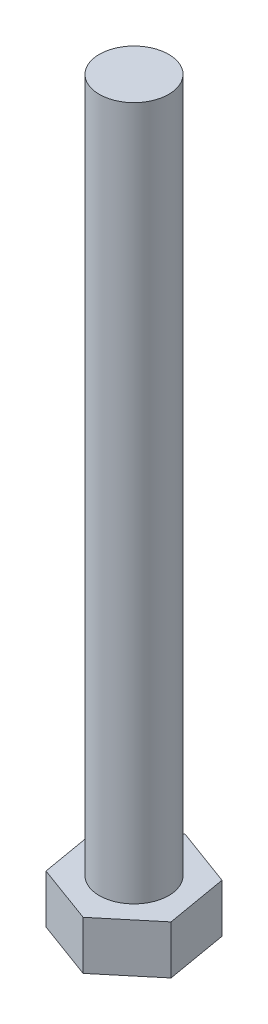
ISO-10303-21;
HEADER;
FILE_DESCRIPTION(('STEP AP214'),'2;1');
FILE_NAME('part.step','',(''),(''),'','','');
FILE_SCHEMA(('AUTOMOTIVE_DESIGN { 1 0 10303 214 1 1 1 1 }'));
ENDSEC;
DATA;
#1=APPLICATION_CONTEXT('core data for automotive mechanical design processes');
#2=APPLICATION_PROTOCOL_DEFINITION('international standard','automotive_design',2000,#1);
#3=PRODUCT_CONTEXT('',#1,'mechanical');
#4=PRODUCT('Part','Part','',(#3));
#5=PRODUCT_RELATED_PRODUCT_CATEGORY('part','',(#4));
#6=PRODUCT_DEFINITION_FORMATION('','',#4);
#7=PRODUCT_DEFINITION_CONTEXT('part definition',#1,'design');
#8=PRODUCT_DEFINITION('design','',#6,#7);
#9=PRODUCT_DEFINITION_SHAPE('','',#8);
#10=(LENGTH_UNIT() NAMED_UNIT(*) SI_UNIT(.MILLI.,.METRE.));
#11=(NAMED_UNIT(*) PLANE_ANGLE_UNIT() SI_UNIT($,.RADIAN.));
#12=(NAMED_UNIT(*) SI_UNIT($,.STERADIAN.) SOLID_ANGLE_UNIT());
#13=UNCERTAINTY_MEASURE_WITH_UNIT(LENGTH_MEASURE(1.E-05),#10,'distance_accuracy_value','');
#14=(GEOMETRIC_REPRESENTATION_CONTEXT(3) GLOBAL_UNCERTAINTY_ASSIGNED_CONTEXT((#13)) GLOBAL_UNIT_ASSIGNED_CONTEXT((#10,
#11,#12)) REPRESENTATION_CONTEXT('',''));
#15=CARTESIAN_POINT('',(0.,0.,0.));
#16=DIRECTION('',(0.,0.,1.));
#17=DIRECTION('',(1.,0.,0.));
#18=AXIS2_PLACEMENT_3D('',#15,#16,#17);
#19=CARTESIAN_POINT('',(4.22329074031474,3.5,1.55364581638536));
#20=DIRECTION('',(0.,1.,0.));
#21=DIRECTION('',(0.,0.,1.));
#22=AXIS2_PLACEMENT_3D('',#19,#20,#21);
#23=PLANE('',#22);
#24=DIRECTION('',(0.768253803473447,0.,-0.640145368997217));
#25=VECTOR('',#24,1.);
#26=CARTESIAN_POINT('',(0.766148624684231,3.5,4.43429997687283));
#27=LINE('',#26,#25);
#28=CARTESIAN_POINT('',(0.766148624684231,3.5,4.43429997687283));
#29=VERTEX_POINT('',#28);
#30=CARTESIAN_POINT('',(4.22329074031474,3.5,1.55364581638536));
#31=VERTEX_POINT('',#30);
#32=EDGE_CURVE('E129',#29,#31,#27,.T.);
#33=ORIENTED_EDGE('',*,*,#32,.T.);
#34=DIRECTION('',(-0.17025524992983,0.,-0.985399994860631));
#35=VECTOR('',#34,1.);
#36=CARTESIAN_POINT('',(4.22329074031474,3.5,1.55364581638536));
#37=LINE('',#36,#35);
#38=CARTESIAN_POINT('',(3.45714211563051,3.5,-2.88065416048747));
#39=VERTEX_POINT('',#38);
#40=EDGE_CURVE('E87',#31,#39,#37,.T.);
#41=ORIENTED_EDGE('',*,*,#40,.T.);
#42=DIRECTION('',(-0.938509053403276,0.,-0.345254625863414));
#43=VECTOR('',#42,1.);
#44=CARTESIAN_POINT('',(3.45714211563051,3.5,-2.88065416048747));
#45=LINE('',#44,#43);
#46=CARTESIAN_POINT('',(-0.766148624684233,3.5,-4.43429997687284));
#47=VERTEX_POINT('',#46);
#48=EDGE_CURVE('E100',#39,#47,#45,.T.);
#49=ORIENTED_EDGE('',*,*,#48,.T.);
#50=DIRECTION('',(-0.768253803473447,0.,0.640145368997217));
#51=VECTOR('',#50,1.);
#52=CARTESIAN_POINT('',(-0.766148624684233,3.5,-4.43429997687284));
#53=LINE('',#52,#51);
#54=CARTESIAN_POINT('',(-4.22329074031474,3.5,-1.55364581638536));
#55=VERTEX_POINT('',#54);
#56=EDGE_CURVE('E94',#47,#55,#53,.T.);
#57=ORIENTED_EDGE('',*,*,#56,.T.);
#58=DIRECTION('',(0.170255249929829,0.,0.985399994860631));
#59=VECTOR('',#58,1.);
#60=CARTESIAN_POINT('',(-4.22329074031474,3.5,-1.55364581638536));
#61=LINE('',#60,#59);
#62=CARTESIAN_POINT('',(-3.45714211563051,3.5,2.88065416048747));
#63=VERTEX_POINT('',#62);
#64=EDGE_CURVE('E98',#55,#63,#61,.T.);
#65=ORIENTED_EDGE('',*,*,#64,.T.);
#66=DIRECTION('',(0.938509053403276,0.,0.345254625863414));
#67=VECTOR('',#66,1.);
#68=CARTESIAN_POINT('',(-3.45714211563051,3.5,2.88065416048747));
#69=LINE('',#68,#67);
#70=EDGE_CURVE('E50',#63,#29,#69,.T.);
#71=ORIENTED_EDGE('',*,*,#70,.T.);
#72=EDGE_LOOP('',(#33,#41,#49,#57,#65,#71));
#73=FACE_BOUND('',#72,.T.);
#74=CARTESIAN_POINT('',(0.,3.5,0.));
#75=DIRECTION('',(0.,1.,0.));
#76=DIRECTION('',(0.,0.,1.));
#77=AXIS2_PLACEMENT_3D('',#74,#75,#76);
#78=CIRCLE('',#77,2.5);
#79=CARTESIAN_POINT('',(0.,3.5,2.5));
#80=VERTEX_POINT('',#79);
#81=EDGE_CURVE('E169',#80,#80,#78,.T.);
#82=ORIENTED_EDGE('',*,*,#81,.F.);
#83=EDGE_LOOP('',(#82));
#84=FACE_BOUND('',#83,.T.);
#85=ADVANCED_FACE('F33',(#73,#84),#23,.T.);
#86=CARTESIAN_POINT('',(0.766148624684231,3.5,4.43429997687283));
#87=DIRECTION('',(-0.640145368997217,0.,-0.768253803473447));
#88=DIRECTION('',(-0.768253803473447,0.,0.640145368997217));
#89=AXIS2_PLACEMENT_3D('',#86,#87,#88);
#90=PLANE('',#89);
#91=DIRECTION('',(0.768253803473447,0.,-0.640145368997217));
#92=VECTOR('',#91,1.);
#93=CARTESIAN_POINT('',(0.766148624684231,0.,4.43429997687283));
#94=LINE('',#93,#92);
#95=CARTESIAN_POINT('',(0.766148624684231,0.,4.43429997687283));
#96=VERTEX_POINT('',#95);
#97=CARTESIAN_POINT('',(4.22329074031474,0.,1.55364581638536));
#98=VERTEX_POINT('',#97);
#99=EDGE_CURVE('E118',#96,#98,#94,.T.);
#100=ORIENTED_EDGE('',*,*,#99,.T.);
#101=DIRECTION('',(0.,-1.,0.));
#102=VECTOR('',#101,1.);
#103=CARTESIAN_POINT('',(4.22329074031474,3.5,1.55364581638536));
#104=LINE('',#103,#102);
#105=EDGE_CURVE('E11',#31,#98,#104,.T.);
#106=ORIENTED_EDGE('',*,*,#105,.F.);
#107=ORIENTED_EDGE('',*,*,#32,.F.);
#108=DIRECTION('',(0.,-1.,0.));
#109=VECTOR('',#108,1.);
#110=CARTESIAN_POINT('',(0.766148624684231,3.5,4.43429997687283));
#111=LINE('',#110,#109);
#112=EDGE_CURVE('E114',#29,#96,#111,.T.);
#113=ORIENTED_EDGE('',*,*,#112,.T.);
#114=EDGE_LOOP('',(#100,#106,#107,#113));
#115=FACE_BOUND('',#114,.T.);
#116=ADVANCED_FACE('F35',(#115),#90,.F.);
#117=CARTESIAN_POINT('',(4.22329074031474,3.5,1.55364581638536));
#118=DIRECTION('',(-0.985399994860631,0.,0.17025524992983));
#119=DIRECTION('',(0.17025524992983,0.,0.985399994860631));
#120=AXIS2_PLACEMENT_3D('',#117,#118,#119);
#121=PLANE('',#120);
#122=DIRECTION('',(-0.17025524992983,0.,-0.985399994860631));
#123=VECTOR('',#122,1.);
#124=CARTESIAN_POINT('',(4.22329074031474,0.,1.55364581638536));
#125=LINE('',#124,#123);
#126=CARTESIAN_POINT('',(3.45714211563051,0.,-2.88065416048747));
#127=VERTEX_POINT('',#126);
#128=EDGE_CURVE('E121',#98,#127,#125,.T.);
#129=ORIENTED_EDGE('',*,*,#128,.T.);
#130=DIRECTION('',(0.,-1.,0.));
#131=VECTOR('',#130,1.);
#132=CARTESIAN_POINT('',(3.45714211563051,3.5,-2.88065416048747));
#133=LINE('',#132,#131);
#134=EDGE_CURVE('E42',#39,#127,#133,.T.);
#135=ORIENTED_EDGE('',*,*,#134,.F.);
#136=ORIENTED_EDGE('',*,*,#40,.F.);
#137=ORIENTED_EDGE('',*,*,#105,.T.);
#138=EDGE_LOOP('',(#129,#135,#136,#137));
#139=FACE_BOUND('',#138,.T.);
#140=ADVANCED_FACE('F157',(#139),#121,.F.);
#141=CARTESIAN_POINT('',(3.45714211563051,3.5,-2.88065416048747));
#142=DIRECTION('',(-0.345254625863414,0.,0.938509053403276));
#143=DIRECTION('',(0.938509053403276,0.,0.345254625863414));
#144=AXIS2_PLACEMENT_3D('',#141,#142,#143);
#145=PLANE('',#144);
#146=DIRECTION('',(-0.938509053403276,0.,-0.345254625863414));
#147=VECTOR('',#146,1.);
#148=CARTESIAN_POINT('',(3.45714211563051,0.,-2.88065416048747));
#149=LINE('',#148,#147);
#150=CARTESIAN_POINT('',(-0.766148624684233,0.,-4.43429997687284));
#151=VERTEX_POINT('',#150);
#152=EDGE_CURVE('E124',#127,#151,#149,.T.);
#153=ORIENTED_EDGE('',*,*,#152,.T.);
#154=DIRECTION('',(0.,-1.,0.));
#155=VECTOR('',#154,1.);
#156=CARTESIAN_POINT('',(-0.766148624684233,3.5,-4.43429997687284));
#157=LINE('',#156,#155);
#158=EDGE_CURVE('E109',#47,#151,#157,.T.);
#159=ORIENTED_EDGE('',*,*,#158,.F.);
#160=ORIENTED_EDGE('',*,*,#48,.F.);
#161=ORIENTED_EDGE('',*,*,#134,.T.);
#162=EDGE_LOOP('',(#153,#159,#160,#161));
#163=FACE_BOUND('',#162,.T.);
#164=ADVANCED_FACE('F135',(#163),#145,.F.);
#165=CARTESIAN_POINT('',(-0.766148624684233,3.5,-4.43429997687284));
#166=DIRECTION('',(0.640145368997217,0.,0.768253803473447));
#167=DIRECTION('',(0.768253803473447,0.,-0.640145368997217));
#168=AXIS2_PLACEMENT_3D('',#165,#166,#167);
#169=PLANE('',#168);
#170=DIRECTION('',(-0.768253803473447,0.,0.640145368997217));
#171=VECTOR('',#170,1.);
#172=CARTESIAN_POINT('',(-0.766148624684233,0.,-4.43429997687284));
#173=LINE('',#172,#171);
#174=CARTESIAN_POINT('',(-4.22329074031474,0.,-1.55364581638536));
#175=VERTEX_POINT('',#174);
#176=EDGE_CURVE('E108',#151,#175,#173,.T.);
#177=ORIENTED_EDGE('',*,*,#176,.T.);
#178=DIRECTION('',(0.,-1.,0.));
#179=VECTOR('',#178,1.);
#180=CARTESIAN_POINT('',(-4.22329074031474,3.5,-1.55364581638536));
#181=LINE('',#180,#179);
#182=EDGE_CURVE('E105',#55,#175,#181,.T.);
#183=ORIENTED_EDGE('',*,*,#182,.F.);
#184=ORIENTED_EDGE('',*,*,#56,.F.);
#185=ORIENTED_EDGE('',*,*,#158,.T.);
#186=EDGE_LOOP('',(#177,#183,#184,#185));
#187=FACE_BOUND('',#186,.T.);
#188=ADVANCED_FACE('F106',(#187),#169,.F.);
#189=CARTESIAN_POINT('',(-4.22329074031474,3.5,-1.55364581638536));
#190=DIRECTION('',(0.985399994860631,0.,-0.170255249929829));
#191=DIRECTION('',(-0.17025524992983,0.,-0.985399994860631));
#192=AXIS2_PLACEMENT_3D('',#189,#190,#191);
#193=PLANE('',#192);
#194=DIRECTION('',(0.170255249929829,0.,0.985399994860631));
#195=VECTOR('',#194,1.);
#196=CARTESIAN_POINT('',(-4.22329074031474,0.,-1.55364581638536));
#197=LINE('',#196,#195);
#198=CARTESIAN_POINT('',(-3.45714211563051,0.,2.88065416048747));
#199=VERTEX_POINT('',#198);
#200=EDGE_CURVE('E73',#175,#199,#197,.T.);
#201=ORIENTED_EDGE('',*,*,#200,.T.);
#202=DIRECTION('',(0.,-1.,0.));
#203=VECTOR('',#202,1.);
#204=CARTESIAN_POINT('',(-3.45714211563051,3.5,2.88065416048747));
#205=LINE('',#204,#203);
#206=EDGE_CURVE('E110',#63,#199,#205,.T.);
#207=ORIENTED_EDGE('',*,*,#206,.F.);
#208=ORIENTED_EDGE('',*,*,#64,.F.);
#209=ORIENTED_EDGE('',*,*,#182,.T.);
#210=EDGE_LOOP('',(#201,#207,#208,#209));
#211=FACE_BOUND('',#210,.T.);
#212=ADVANCED_FACE('F112',(#211),#193,.F.);
#213=CARTESIAN_POINT('',(-3.45714211563051,3.5,2.88065416048747));
#214=DIRECTION('',(0.345254625863414,0.,-0.938509053403276));
#215=DIRECTION('',(-0.938509053403276,0.,-0.345254625863414));
#216=AXIS2_PLACEMENT_3D('',#213,#214,#215);
#217=PLANE('',#216);
#218=DIRECTION('',(0.938509053403276,0.,0.345254625863414));
#219=VECTOR('',#218,1.);
#220=CARTESIAN_POINT('',(-3.45714211563051,0.,2.88065416048747));
#221=LINE('',#220,#219);
#222=EDGE_CURVE('E79',#199,#96,#221,.T.);
#223=ORIENTED_EDGE('',*,*,#222,.T.);
#224=ORIENTED_EDGE('',*,*,#112,.F.);
#225=ORIENTED_EDGE('',*,*,#70,.F.);
#226=ORIENTED_EDGE('',*,*,#206,.T.);
#227=EDGE_LOOP('',(#223,#224,#225,#226));
#228=FACE_BOUND('',#227,.T.);
#229=ADVANCED_FACE('F142',(#228),#217,.F.);
#230=CARTESIAN_POINT('',(4.22329074031474,0.,1.55364581638536));
#231=DIRECTION('',(0.,1.,0.));
#232=DIRECTION('',(0.,0.,1.));
#233=AXIS2_PLACEMENT_3D('',#230,#231,#232);
#234=PLANE('',#233);
#235=ORIENTED_EDGE('',*,*,#99,.F.);
#236=ORIENTED_EDGE('',*,*,#222,.F.);
#237=ORIENTED_EDGE('',*,*,#200,.F.);
#238=ORIENTED_EDGE('',*,*,#176,.F.);
#239=ORIENTED_EDGE('',*,*,#152,.F.);
#240=ORIENTED_EDGE('',*,*,#128,.F.);
#241=EDGE_LOOP('',(#235,#236,#237,#238,#239,#240));
#242=FACE_BOUND('',#241,.T.);
#243=ADVANCED_FACE('F138',(#242),#234,.F.);
#244=CARTESIAN_POINT('',(0.,53.5,0.));
#245=DIRECTION('',(0.,-1.,0.));
#246=DIRECTION('',(0.,0.,-1.));
#247=AXIS2_PLACEMENT_3D('',#244,#245,#246);
#248=CYLINDRICAL_SURFACE('',#247,2.5);
#249=CARTESIAN_POINT('',(0.,53.5,0.));
#250=DIRECTION('',(0.,1.,0.));
#251=DIRECTION('',(0.,0.,1.));
#252=AXIS2_PLACEMENT_3D('',#249,#250,#251);
#253=CIRCLE('',#252,2.5);
#254=CARTESIAN_POINT('',(0.,53.5,2.5));
#255=VERTEX_POINT('',#254);
#256=EDGE_CURVE('E122',#255,#255,#253,.T.);
#257=ORIENTED_EDGE('',*,*,#256,.F.);
#258=EDGE_LOOP('',(#257));
#259=FACE_BOUND('',#258,.T.);
#260=ORIENTED_EDGE('',*,*,#81,.T.);
#261=EDGE_LOOP('',(#260));
#262=FACE_BOUND('',#261,.T.);
#263=ADVANCED_FACE('F149',(#259,#262),#248,.T.);
#264=CARTESIAN_POINT('',(0.,53.5,0.));
#265=DIRECTION('',(0.,1.,0.));
#266=DIRECTION('',(0.,0.,1.));
#267=AXIS2_PLACEMENT_3D('',#264,#265,#266);
#268=PLANE('',#267);
#269=ORIENTED_EDGE('',*,*,#256,.T.);
#270=EDGE_LOOP('',(#269));
#271=FACE_BOUND('',#270,.T.);
#272=ADVANCED_FACE('F161',(#271),#268,.T.);
#273=CLOSED_SHELL('',(#85,#116,#140,#164,#188,#212,#229,#243,#263,#272));
#274=MANIFOLD_SOLID_BREP('B2',#273);
#275=ADVANCED_BREP_SHAPE_REPRESENTATION('',(#18,#274),#14);
#276=SHAPE_DEFINITION_REPRESENTATION(#9,#275);
ENDSEC;
END-ISO-10303-21;
